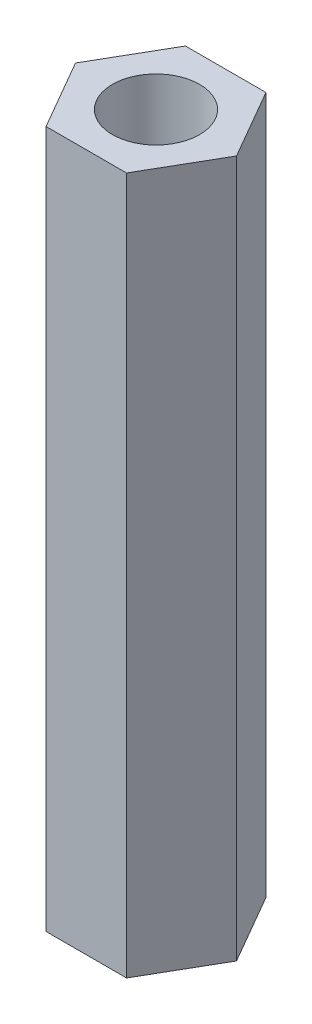
ISO-10303-21;
HEADER;
FILE_DESCRIPTION(('STEP AP214'),'2;1');
FILE_NAME('part.step','',(''),(''),'','','');
FILE_SCHEMA(('AUTOMOTIVE_DESIGN { 1 0 10303 214 1 1 1 1 }'));
ENDSEC;
DATA;
#1=APPLICATION_CONTEXT('core data for automotive mechanical design processes');
#2=APPLICATION_PROTOCOL_DEFINITION('international standard','automotive_design',2000,#1);
#3=PRODUCT_CONTEXT('',#1,'mechanical');
#4=PRODUCT('Part','Part','',(#3));
#5=PRODUCT_RELATED_PRODUCT_CATEGORY('part','',(#4));
#6=PRODUCT_DEFINITION_FORMATION('','',#4);
#7=PRODUCT_DEFINITION_CONTEXT('part definition',#1,'design');
#8=PRODUCT_DEFINITION('design','',#6,#7);
#9=PRODUCT_DEFINITION_SHAPE('','',#8);
#10=(LENGTH_UNIT() NAMED_UNIT(*) SI_UNIT(.MILLI.,.METRE.));
#11=(NAMED_UNIT(*) PLANE_ANGLE_UNIT() SI_UNIT($,.RADIAN.));
#12=(NAMED_UNIT(*) SI_UNIT($,.STERADIAN.) SOLID_ANGLE_UNIT());
#13=UNCERTAINTY_MEASURE_WITH_UNIT(LENGTH_MEASURE(1.E-05),#10,'distance_accuracy_value','');
#14=(GEOMETRIC_REPRESENTATION_CONTEXT(3) GLOBAL_UNCERTAINTY_ASSIGNED_CONTEXT((#13)) GLOBAL_UNIT_ASSIGNED_CONTEXT((#10,
#11,#12)) REPRESENTATION_CONTEXT('',''));
#15=CARTESIAN_POINT('',(0.,0.,0.));
#16=DIRECTION('',(0.,0.,1.));
#17=DIRECTION('',(1.,0.,0.));
#18=AXIS2_PLACEMENT_3D('',#15,#16,#17);
#19=CARTESIAN_POINT('',(1.15470053837927,20.,1.99999999999998));
#20=DIRECTION('',(-0.866025403784442,0.,-0.499999999999995));
#21=DIRECTION('',(-0.499999999999995,0.,0.866025403784442));
#22=AXIS2_PLACEMENT_3D('',#19,#20,#21);
#23=PLANE('',#22);
#24=DIRECTION('',(0.499999999999995,0.,-0.866025403784442));
#25=VECTOR('',#24,1.);
#26=CARTESIAN_POINT('',(1.15470053837927,0.,1.99999999999998));
#27=LINE('',#26,#25);
#28=CARTESIAN_POINT('',(1.15470053837927,0.,1.99999999999998));
#29=VERTEX_POINT('',#28);
#30=CARTESIAN_POINT('',(2.30940107675849,0.,0.));
#31=VERTEX_POINT('',#30);
#32=EDGE_CURVE('E119',#29,#31,#27,.T.);
#33=ORIENTED_EDGE('',*,*,#32,.T.);
#34=DIRECTION('',(0.,-1.,0.));
#35=VECTOR('',#34,1.);
#36=CARTESIAN_POINT('',(2.30940107675849,20.,0.));
#37=LINE('',#36,#35);
#38=CARTESIAN_POINT('',(2.30940107675849,20.,0.));
#39=VERTEX_POINT('',#38);
#40=EDGE_CURVE('E11',#39,#31,#37,.T.);
#41=ORIENTED_EDGE('',*,*,#40,.F.);
#42=DIRECTION('',(0.499999999999995,0.,-0.866025403784442));
#43=VECTOR('',#42,1.);
#44=CARTESIAN_POINT('',(1.15470053837927,20.,1.99999999999998));
#45=LINE('',#44,#43);
#46=CARTESIAN_POINT('',(1.15470053837927,20.,1.99999999999998));
#47=VERTEX_POINT('',#46);
#48=EDGE_CURVE('E130',#47,#39,#45,.T.);
#49=ORIENTED_EDGE('',*,*,#48,.F.);
#50=DIRECTION('',(0.,-1.,0.));
#51=VECTOR('',#50,1.);
#52=CARTESIAN_POINT('',(1.15470053837927,20.,1.99999999999998));
#53=LINE('',#52,#51);
#54=EDGE_CURVE('E115',#47,#29,#53,.T.);
#55=ORIENTED_EDGE('',*,*,#54,.T.);
#56=EDGE_LOOP('',(#33,#41,#49,#55));
#57=FACE_BOUND('',#56,.T.);
#58=ADVANCED_FACE('F35',(#57),#23,.F.);
#59=CARTESIAN_POINT('',(2.30940107675849,20.,0.));
#60=DIRECTION('',(-0.866025403784438,0.,0.500000000000001));
#61=DIRECTION('',(0.500000000000001,0.,0.866025403784438));
#62=AXIS2_PLACEMENT_3D('',#59,#60,#61);
#63=PLANE('',#62);
#64=DIRECTION('',(-0.500000000000001,0.,-0.866025403784438));
#65=VECTOR('',#64,1.);
#66=CARTESIAN_POINT('',(2.30940107675849,0.,0.));
#67=LINE('',#66,#65);
#68=CARTESIAN_POINT('',(1.15470053837924,0.,-1.99999999999999));
#69=VERTEX_POINT('',#68);
#70=EDGE_CURVE('E122',#31,#69,#67,.T.);
#71=ORIENTED_EDGE('',*,*,#70,.T.);
#72=DIRECTION('',(0.,-1.,0.));
#73=VECTOR('',#72,1.);
#74=CARTESIAN_POINT('',(1.15470053837924,20.,-1.99999999999999));
#75=LINE('',#74,#73);
#76=CARTESIAN_POINT('',(1.15470053837924,20.,-1.99999999999999));
#77=VERTEX_POINT('',#76);
#78=EDGE_CURVE('E43',#77,#69,#75,.T.);
#79=ORIENTED_EDGE('',*,*,#78,.F.);
#80=DIRECTION('',(-0.500000000000001,0.,-0.866025403784438));
#81=VECTOR('',#80,1.);
#82=CARTESIAN_POINT('',(2.30940107675849,20.,0.));
#83=LINE('',#82,#81);
#84=EDGE_CURVE('E88',#39,#77,#83,.T.);
#85=ORIENTED_EDGE('',*,*,#84,.F.);
#86=ORIENTED_EDGE('',*,*,#40,.T.);
#87=EDGE_LOOP('',(#71,#79,#85,#86));
#88=FACE_BOUND('',#87,.T.);
#89=ADVANCED_FACE('F155',(#88),#63,.F.);
#90=CARTESIAN_POINT('',(1.15470053837924,20.,-1.99999999999999));
#91=DIRECTION('',(0.,0.,1.));
#92=DIRECTION('',(1.,0.,0.));
#93=AXIS2_PLACEMENT_3D('',#90,#91,#92);
#94=PLANE('',#93);
#95=DIRECTION('',(-1.,0.,0.));
#96=VECTOR('',#95,1.);
#97=CARTESIAN_POINT('',(1.15470053837924,0.,-1.99999999999999));
#98=LINE('',#97,#96);
#99=CARTESIAN_POINT('',(-1.15470053837926,0.,-1.99999999999999));
#100=VERTEX_POINT('',#99);
#101=EDGE_CURVE('E125',#69,#100,#98,.T.);
#102=ORIENTED_EDGE('',*,*,#101,.T.);
#103=DIRECTION('',(0.,-1.,0.));
#104=VECTOR('',#103,1.);
#105=CARTESIAN_POINT('',(-1.15470053837926,20.,-1.99999999999999));
#106=LINE('',#105,#104);
#107=CARTESIAN_POINT('',(-1.15470053837926,20.,-1.99999999999999));
#108=VERTEX_POINT('',#107);
#109=EDGE_CURVE('E110',#108,#100,#106,.T.);
#110=ORIENTED_EDGE('',*,*,#109,.F.);
#111=DIRECTION('',(-1.,0.,0.));
#112=VECTOR('',#111,1.);
#113=CARTESIAN_POINT('',(1.15470053837924,20.,-1.99999999999999));
#114=LINE('',#113,#112);
#115=EDGE_CURVE('E101',#77,#108,#114,.T.);
#116=ORIENTED_EDGE('',*,*,#115,.F.);
#117=ORIENTED_EDGE('',*,*,#78,.T.);
#118=EDGE_LOOP('',(#102,#110,#116,#117));
#119=FACE_BOUND('',#118,.T.);
#120=ADVANCED_FACE('F136',(#119),#94,.F.);
#121=CARTESIAN_POINT('',(-1.15470053837926,20.,-1.99999999999999));
#122=DIRECTION('',(0.866025403784442,0.,0.499999999999995));
#123=DIRECTION('',(0.499999999999995,0.,-0.866025403784442));
#124=AXIS2_PLACEMENT_3D('',#121,#122,#123);
#125=PLANE('',#124);
#126=DIRECTION('',(-0.499999999999995,0.,0.866025403784441));
#127=VECTOR('',#126,1.);
#128=CARTESIAN_POINT('',(-1.15470053837926,0.,-1.99999999999999));
#129=LINE('',#128,#127);
#130=CARTESIAN_POINT('',(-2.30940107675849,0.,0.));
#131=VERTEX_POINT('',#130);
#132=EDGE_CURVE('E109',#100,#131,#129,.T.);
#133=ORIENTED_EDGE('',*,*,#132,.T.);
#134=DIRECTION('',(0.,-1.,0.));
#135=VECTOR('',#134,1.);
#136=CARTESIAN_POINT('',(-2.30940107675849,20.,0.));
#137=LINE('',#136,#135);
#138=CARTESIAN_POINT('',(-2.30940107675849,20.,0.));
#139=VERTEX_POINT('',#138);
#140=EDGE_CURVE('E106',#139,#131,#137,.T.);
#141=ORIENTED_EDGE('',*,*,#140,.F.);
#142=DIRECTION('',(-0.499999999999995,0.,0.866025403784441));
#143=VECTOR('',#142,1.);
#144=CARTESIAN_POINT('',(-1.15470053837926,20.,-1.99999999999999));
#145=LINE('',#144,#143);
#146=EDGE_CURVE('E95',#108,#139,#145,.T.);
#147=ORIENTED_EDGE('',*,*,#146,.F.);
#148=ORIENTED_EDGE('',*,*,#109,.T.);
#149=EDGE_LOOP('',(#133,#141,#147,#148));
#150=FACE_BOUND('',#149,.T.);
#151=ADVANCED_FACE('F107',(#150),#125,.F.);
#152=CARTESIAN_POINT('',(-2.30940107675849,20.,0.));
#153=DIRECTION('',(0.866025403784435,0.,-0.500000000000007));
#154=DIRECTION('',(-0.500000000000007,0.,-0.866025403784435));
#155=AXIS2_PLACEMENT_3D('',#152,#153,#154);
#156=PLANE('',#155);
#157=DIRECTION('',(0.500000000000007,0.,0.866025403784434));
#158=VECTOR('',#157,1.);
#159=CARTESIAN_POINT('',(-2.30940107675849,0.,0.));
#160=LINE('',#159,#158);
#161=CARTESIAN_POINT('',(-1.15470053837923,0.,2.));
#162=VERTEX_POINT('',#161);
#163=EDGE_CURVE('E74',#131,#162,#160,.T.);
#164=ORIENTED_EDGE('',*,*,#163,.T.);
#165=DIRECTION('',(0.,-1.,0.));
#166=VECTOR('',#165,1.);
#167=CARTESIAN_POINT('',(-1.15470053837923,20.,2.));
#168=LINE('',#167,#166);
#169=CARTESIAN_POINT('',(-1.15470053837923,20.,2.));
#170=VERTEX_POINT('',#169);
#171=EDGE_CURVE('E111',#170,#162,#168,.T.);
#172=ORIENTED_EDGE('',*,*,#171,.F.);
#173=DIRECTION('',(0.500000000000007,0.,0.866025403784434));
#174=VECTOR('',#173,1.);
#175=CARTESIAN_POINT('',(-2.30940107675849,20.,0.));
#176=LINE('',#175,#174);
#177=EDGE_CURVE('E99',#139,#170,#176,.T.);
#178=ORIENTED_EDGE('',*,*,#177,.F.);
#179=ORIENTED_EDGE('',*,*,#140,.T.);
#180=EDGE_LOOP('',(#164,#172,#178,#179));
#181=FACE_BOUND('',#180,.T.);
#182=ADVANCED_FACE('F113',(#181),#156,.F.);
#183=CARTESIAN_POINT('',(-1.15470053837923,20.,2.));
#184=DIRECTION('',(0.,0.,-1.));
#185=DIRECTION('',(-1.,0.,0.));
#186=AXIS2_PLACEMENT_3D('',#183,#184,#185);
#187=PLANE('',#186);
#188=DIRECTION('',(1.,0.,0.));
#189=VECTOR('',#188,1.);
#190=CARTESIAN_POINT('',(-1.15470053837923,0.,2.));
#191=LINE('',#190,#189);
#192=EDGE_CURVE('E80',#162,#29,#191,.T.);
#193=ORIENTED_EDGE('',*,*,#192,.T.);
#194=ORIENTED_EDGE('',*,*,#54,.F.);
#195=DIRECTION('',(1.,0.,0.));
#196=VECTOR('',#195,1.);
#197=CARTESIAN_POINT('',(-1.15470053837923,20.,2.));
#198=LINE('',#197,#196);
#199=EDGE_CURVE('E51',#170,#47,#198,.T.);
#200=ORIENTED_EDGE('',*,*,#199,.F.);
#201=ORIENTED_EDGE('',*,*,#171,.T.);
#202=EDGE_LOOP('',(#193,#194,#200,#201));
#203=FACE_BOUND('',#202,.T.);
#204=ADVANCED_FACE('F143',(#203),#187,.F.);
#205=CARTESIAN_POINT('',(0.,20.,0.));
#206=DIRECTION('',(0.,1.,0.));
#207=DIRECTION('',(0.,0.,1.));
#208=AXIS2_PLACEMENT_3D('',#205,#206,#207);
#209=PLANE('',#208);
#210=CARTESIAN_POINT('',(0.,20.,0.));
#211=DIRECTION('',(0.,-1.,0.));
#212=DIRECTION('',(0.,0.,-1.));
#213=AXIS2_PLACEMENT_3D('',#210,#211,#212);
#214=CIRCLE('',#213,1.25);
#215=CARTESIAN_POINT('',(0.,20.,-1.25));
#216=VERTEX_POINT('',#215);
#217=EDGE_CURVE('E123',#216,#216,#214,.T.);
#218=ORIENTED_EDGE('',*,*,#217,.T.);
#219=EDGE_LOOP('',(#218));
#220=FACE_BOUND('',#219,.T.);
#221=ORIENTED_EDGE('',*,*,#48,.T.);
#222=ORIENTED_EDGE('',*,*,#84,.T.);
#223=ORIENTED_EDGE('',*,*,#115,.T.);
#224=ORIENTED_EDGE('',*,*,#146,.T.);
#225=ORIENTED_EDGE('',*,*,#177,.T.);
#226=ORIENTED_EDGE('',*,*,#199,.T.);
#227=EDGE_LOOP('',(#221,#222,#223,#224,#225,#226));
#228=FACE_BOUND('',#227,.T.);
#229=ADVANCED_FACE('F97',(#220,#228),#209,.T.);
#230=CARTESIAN_POINT('',(0.,0.,0.));
#231=DIRECTION('',(0.,1.,0.));
#232=DIRECTION('',(0.,0.,1.));
#233=AXIS2_PLACEMENT_3D('',#230,#231,#232);
#234=PLANE('',#233);
#235=CARTESIAN_POINT('',(0.,0.,0.));
#236=DIRECTION('',(0.,-1.,0.));
#237=DIRECTION('',(0.,0.,-1.));
#238=AXIS2_PLACEMENT_3D('',#235,#236,#237);
#239=CIRCLE('',#238,1.24999999999999);
#240=CARTESIAN_POINT('',(0.,0.,-1.24999999999999));
#241=VERTEX_POINT('',#240);
#242=EDGE_CURVE('E212',#241,#241,#239,.T.);
#243=ORIENTED_EDGE('',*,*,#242,.F.);
#244=EDGE_LOOP('',(#243));
#245=FACE_BOUND('',#244,.T.);
#246=ORIENTED_EDGE('',*,*,#32,.F.);
#247=ORIENTED_EDGE('',*,*,#192,.F.);
#248=ORIENTED_EDGE('',*,*,#163,.F.);
#249=ORIENTED_EDGE('',*,*,#132,.F.);
#250=ORIENTED_EDGE('',*,*,#101,.F.);
#251=ORIENTED_EDGE('',*,*,#70,.F.);
#252=EDGE_LOOP('',(#246,#247,#248,#249,#250,#251));
#253=FACE_BOUND('',#252,.T.);
#254=ADVANCED_FACE('F139',(#245,#253),#234,.F.);
#255=CARTESIAN_POINT('',(0.,0.,0.));
#256=DIRECTION('',(0.,-1.,0.));
#257=DIRECTION('',(0.,0.,-1.));
#258=AXIS2_PLACEMENT_3D('',#255,#256,#257);
#259=CYLINDRICAL_SURFACE('',#258,1.24999999999999);
#260=ORIENTED_EDGE('',*,*,#217,.F.);
#261=EDGE_LOOP('',(#260));
#262=FACE_BOUND('',#261,.T.);
#263=ORIENTED_EDGE('',*,*,#242,.T.);
#264=EDGE_LOOP('',(#263));
#265=FACE_BOUND('',#264,.T.);
#266=ADVANCED_FACE('F192',(#262,#265),#259,.F.);
#267=CLOSED_SHELL('',(#58,#89,#120,#151,#182,#204,#229,#254,#266));
#268=MANIFOLD_SOLID_BREP('B2',#267);
#269=ADVANCED_BREP_SHAPE_REPRESENTATION('',(#18,#268),#14);
#270=SHAPE_DEFINITION_REPRESENTATION(#9,#269);
ENDSEC;
END-ISO-10303-21;
